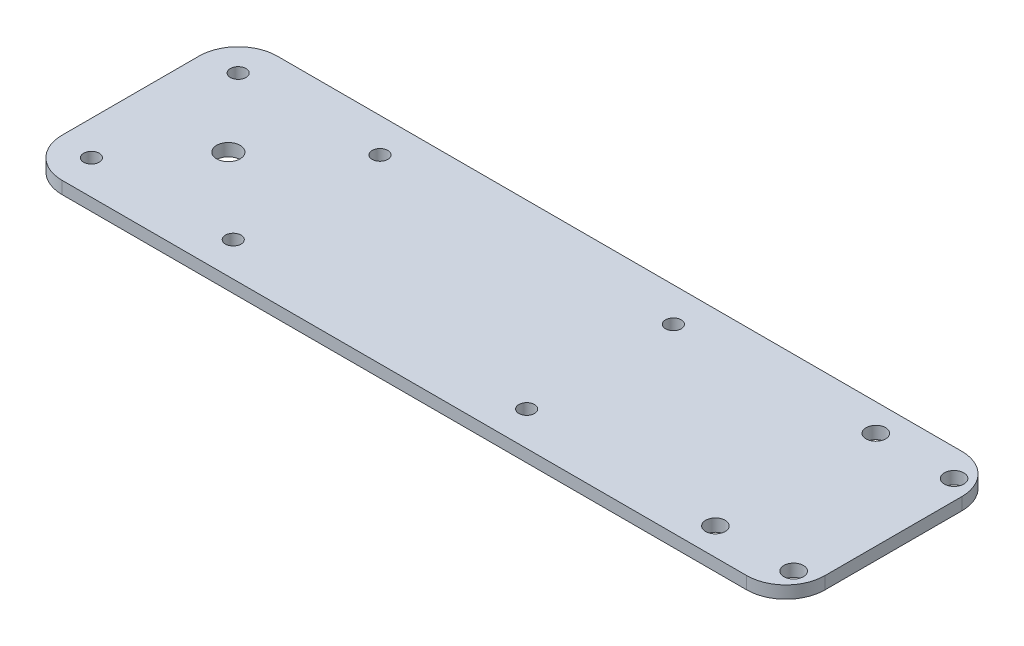
ISO-10303-21;
HEADER;
FILE_DESCRIPTION(('STEP AP214'),'2;1');
FILE_NAME('part.step','',(''),(''),'','','');
FILE_SCHEMA(('AUTOMOTIVE_DESIGN { 1 0 10303 214 1 1 1 1 }'));
ENDSEC;
DATA;
#1=APPLICATION_CONTEXT('core data for automotive mechanical design processes');
#2=APPLICATION_PROTOCOL_DEFINITION('international standard','automotive_design',2000,#1);
#3=PRODUCT_CONTEXT('',#1,'mechanical');
#4=PRODUCT('Part','Part','',(#3));
#5=PRODUCT_RELATED_PRODUCT_CATEGORY('part','',(#4));
#6=PRODUCT_DEFINITION_FORMATION('','',#4);
#7=PRODUCT_DEFINITION_CONTEXT('part definition',#1,'design');
#8=PRODUCT_DEFINITION('design','',#6,#7);
#9=PRODUCT_DEFINITION_SHAPE('','',#8);
#10=(LENGTH_UNIT() NAMED_UNIT(*) SI_UNIT(.MILLI.,.METRE.));
#11=(NAMED_UNIT(*) PLANE_ANGLE_UNIT() SI_UNIT($,.RADIAN.));
#12=(NAMED_UNIT(*) SI_UNIT($,.STERADIAN.) SOLID_ANGLE_UNIT());
#13=UNCERTAINTY_MEASURE_WITH_UNIT(LENGTH_MEASURE(1.E-05),#10,'distance_accuracy_value','');
#14=(GEOMETRIC_REPRESENTATION_CONTEXT(3) GLOBAL_UNCERTAINTY_ASSIGNED_CONTEXT((#13)) GLOBAL_UNIT_ASSIGNED_CONTEXT((#10,
#11,#12)) REPRESENTATION_CONTEXT('',''));
#15=CARTESIAN_POINT('',(0.,0.,0.));
#16=DIRECTION('',(0.,0.,1.));
#17=DIRECTION('',(1.,0.,0.));
#18=AXIS2_PLACEMENT_3D('',#15,#16,#17);
#19=CARTESIAN_POINT('',(-25.,3.175,-27.5));
#20=DIRECTION('',(1.,0.,0.));
#21=DIRECTION('',(0.,0.,-1.));
#22=AXIS2_PLACEMENT_3D('',#19,#20,#21);
#23=PLANE('',#22);
#24=DIRECTION('',(0.,0.,1.));
#25=VECTOR('',#24,1.);
#26=CARTESIAN_POINT('',(-25.,0.,-27.5));
#27=LINE('',#26,#25);
#28=CARTESIAN_POINT('',(-25.,0.,-17.5));
#29=VERTEX_POINT('',#28);
#30=CARTESIAN_POINT('',(-25.,0.,17.5));
#31=VERTEX_POINT('',#30);
#32=EDGE_CURVE('E136',#29,#31,#27,.T.);
#33=ORIENTED_EDGE('',*,*,#32,.T.);
#34=DIRECTION('',(0.,-1.,0.));
#35=VECTOR('',#34,1.);
#36=CARTESIAN_POINT('',(-25.,3.175,17.5));
#37=LINE('',#36,#35);
#38=CARTESIAN_POINT('',(-25.,3.175,17.5));
#39=VERTEX_POINT('',#38);
#40=EDGE_CURVE('E111',#31,#39,#37,.F.);
#41=ORIENTED_EDGE('',*,*,#40,.T.);
#42=DIRECTION('',(0.,0.,1.));
#43=VECTOR('',#42,1.);
#44=CARTESIAN_POINT('',(-25.,3.175,-27.5));
#45=LINE('',#44,#43);
#46=CARTESIAN_POINT('',(-25.,3.175,-17.5));
#47=VERTEX_POINT('',#46);
#48=EDGE_CURVE('E149',#47,#39,#45,.T.);
#49=ORIENTED_EDGE('',*,*,#48,.F.);
#50=DIRECTION('',(0.,-1.,0.));
#51=VECTOR('',#50,1.);
#52=CARTESIAN_POINT('',(-25.,3.175,-17.5));
#53=LINE('',#52,#51);
#54=EDGE_CURVE('E117',#47,#29,#53,.T.);
#55=ORIENTED_EDGE('',*,*,#54,.T.);
#56=EDGE_LOOP('',(#33,#41,#49,#55));
#57=FACE_BOUND('',#56,.T.);
#58=ADVANCED_FACE('F39',(#57),#23,.F.);
#59=CARTESIAN_POINT('',(-25.,3.175,27.5));
#60=DIRECTION('',(0.,0.,-1.));
#61=DIRECTION('',(-1.,0.,0.));
#62=AXIS2_PLACEMENT_3D('',#59,#60,#61);
#63=PLANE('',#62);
#64=DIRECTION('',(1.,0.,0.));
#65=VECTOR('',#64,1.);
#66=CARTESIAN_POINT('',(-25.,3.175,27.5));
#67=LINE('',#66,#65);
#68=CARTESIAN_POINT('',(-15.,3.175,27.5));
#69=VERTEX_POINT('',#68);
#70=CARTESIAN_POINT('',(160.,3.175,27.5));
#71=VERTEX_POINT('',#70);
#72=EDGE_CURVE('E127',#69,#71,#67,.T.);
#73=ORIENTED_EDGE('',*,*,#72,.F.);
#74=DIRECTION('',(0.,-1.,0.));
#75=VECTOR('',#74,1.);
#76=CARTESIAN_POINT('',(-15.,3.175,27.5));
#77=LINE('',#76,#75);
#78=CARTESIAN_POINT('',(-15.,0.,27.5));
#79=VERTEX_POINT('',#78);
#80=EDGE_CURVE('E110',#69,#79,#77,.T.);
#81=ORIENTED_EDGE('',*,*,#80,.T.);
#82=DIRECTION('',(1.,0.,0.));
#83=VECTOR('',#82,1.);
#84=CARTESIAN_POINT('',(-25.,0.,27.5));
#85=LINE('',#84,#83);
#86=CARTESIAN_POINT('',(160.,0.,27.5));
#87=VERTEX_POINT('',#86);
#88=EDGE_CURVE('E124',#79,#87,#85,.T.);
#89=ORIENTED_EDGE('',*,*,#88,.T.);
#90=DIRECTION('',(0.,-1.,0.));
#91=VECTOR('',#90,1.);
#92=CARTESIAN_POINT('',(160.,3.175,27.5));
#93=LINE('',#92,#91);
#94=EDGE_CURVE('E130',#87,#71,#93,.F.);
#95=ORIENTED_EDGE('',*,*,#94,.T.);
#96=EDGE_LOOP('',(#73,#81,#89,#95));
#97=FACE_BOUND('',#96,.T.);
#98=ADVANCED_FACE('F123',(#97),#63,.F.);
#99=CARTESIAN_POINT('',(170.,3.175,-27.5));
#100=DIRECTION('',(-1.,0.,0.));
#101=DIRECTION('',(0.,0.,1.));
#102=AXIS2_PLACEMENT_3D('',#99,#100,#101);
#103=PLANE('',#102);
#104=DIRECTION('',(0.,0.,-1.));
#105=VECTOR('',#104,1.);
#106=CARTESIAN_POINT('',(170.,0.,-27.5));
#107=LINE('',#106,#105);
#108=CARTESIAN_POINT('',(170.,0.,17.5));
#109=VERTEX_POINT('',#108);
#110=CARTESIAN_POINT('',(170.,0.,-17.5));
#111=VERTEX_POINT('',#110);
#112=EDGE_CURVE('E135',#109,#111,#107,.T.);
#113=ORIENTED_EDGE('',*,*,#112,.T.);
#114=DIRECTION('',(0.,-1.,0.));
#115=VECTOR('',#114,1.);
#116=CARTESIAN_POINT('',(170.,3.175,-17.5));
#117=LINE('',#116,#115);
#118=CARTESIAN_POINT('',(170.,3.175,-17.5));
#119=VERTEX_POINT('',#118);
#120=EDGE_CURVE('E11',#111,#119,#117,.F.);
#121=ORIENTED_EDGE('',*,*,#120,.T.);
#122=DIRECTION('',(0.,0.,-1.));
#123=VECTOR('',#122,1.);
#124=CARTESIAN_POINT('',(170.,3.175,-27.5));
#125=LINE('',#124,#123);
#126=CARTESIAN_POINT('',(170.,3.175,17.5));
#127=VERTEX_POINT('',#126);
#128=EDGE_CURVE('E188',#127,#119,#125,.T.);
#129=ORIENTED_EDGE('',*,*,#128,.F.);
#130=DIRECTION('',(0.,-1.,0.));
#131=VECTOR('',#130,1.);
#132=CARTESIAN_POINT('',(170.,3.175,17.5));
#133=LINE('',#132,#131);
#134=EDGE_CURVE('E48',#127,#109,#133,.T.);
#135=ORIENTED_EDGE('',*,*,#134,.T.);
#136=EDGE_LOOP('',(#113,#121,#129,#135));
#137=FACE_BOUND('',#136,.T.);
#138=ADVANCED_FACE('F186',(#137),#103,.F.);
#139=CARTESIAN_POINT('',(-25.,3.175,-27.5));
#140=DIRECTION('',(0.,0.,1.));
#141=DIRECTION('',(1.,0.,0.));
#142=AXIS2_PLACEMENT_3D('',#139,#140,#141);
#143=PLANE('',#142);
#144=DIRECTION('',(-1.,0.,0.));
#145=VECTOR('',#144,1.);
#146=CARTESIAN_POINT('',(-25.,0.,-27.5));
#147=LINE('',#146,#145);
#148=CARTESIAN_POINT('',(160.,0.,-27.5));
#149=VERTEX_POINT('',#148);
#150=CARTESIAN_POINT('',(-15.,0.,-27.5));
#151=VERTEX_POINT('',#150);
#152=EDGE_CURVE('E141',#149,#151,#147,.T.);
#153=ORIENTED_EDGE('',*,*,#152,.T.);
#154=DIRECTION('',(0.,-1.,0.));
#155=VECTOR('',#154,1.);
#156=CARTESIAN_POINT('',(-15.,3.175,-27.5));
#157=LINE('',#156,#155);
#158=CARTESIAN_POINT('',(-15.,3.175,-27.5));
#159=VERTEX_POINT('',#158);
#160=EDGE_CURVE('E55',#151,#159,#157,.F.);
#161=ORIENTED_EDGE('',*,*,#160,.T.);
#162=DIRECTION('',(-1.,0.,0.));
#163=VECTOR('',#162,1.);
#164=CARTESIAN_POINT('',(-25.,3.175,-27.5));
#165=LINE('',#164,#163);
#166=CARTESIAN_POINT('',(160.,3.175,-27.5));
#167=VERTEX_POINT('',#166);
#168=EDGE_CURVE('E151',#167,#159,#165,.T.);
#169=ORIENTED_EDGE('',*,*,#168,.F.);
#170=DIRECTION('',(0.,-1.,0.));
#171=VECTOR('',#170,1.);
#172=CARTESIAN_POINT('',(160.,3.175,-27.5));
#173=LINE('',#172,#171);
#174=EDGE_CURVE('E176',#167,#149,#173,.T.);
#175=ORIENTED_EDGE('',*,*,#174,.T.);
#176=EDGE_LOOP('',(#153,#161,#169,#175));
#177=FACE_BOUND('',#176,.T.);
#178=ADVANCED_FACE('F195',(#177),#143,.F.);
#179=CARTESIAN_POINT('',(0.,3.175,0.));
#180=DIRECTION('',(0.,1.,0.));
#181=DIRECTION('',(0.,0.,1.));
#182=AXIS2_PLACEMENT_3D('',#179,#180,#181);
#183=PLANE('',#182);
#184=CARTESIAN_POINT('',(165.,3.175,-20.5));
#185=DIRECTION('',(0.,1.,0.));
#186=DIRECTION('',(0.,0.,1.));
#187=AXIS2_PLACEMENT_3D('',#184,#185,#186);
#188=CIRCLE('',#187,2.5);
#189=CARTESIAN_POINT('',(165.,3.175,-18.));
#190=VERTEX_POINT('',#189);
#191=EDGE_CURVE('E289',#190,#190,#188,.T.);
#192=ORIENTED_EDGE('',*,*,#191,.F.);
#193=EDGE_LOOP('',(#192));
#194=FACE_BOUND('',#193,.T.);
#195=CARTESIAN_POINT('',(145.,3.175,-20.5));
#196=DIRECTION('',(0.,1.,0.));
#197=DIRECTION('',(0.,0.,1.));
#198=AXIS2_PLACEMENT_3D('',#195,#196,#197);
#199=CIRCLE('',#198,2.5);
#200=CARTESIAN_POINT('',(145.,3.175,-18.));
#201=VERTEX_POINT('',#200);
#202=EDGE_CURVE('E281',#201,#201,#199,.T.);
#203=ORIENTED_EDGE('',*,*,#202,.F.);
#204=EDGE_LOOP('',(#203));
#205=FACE_BOUND('',#204,.T.);
#206=CARTESIAN_POINT('',(165.,3.175,20.5));
#207=DIRECTION('',(0.,1.,0.));
#208=DIRECTION('',(0.,0.,1.));
#209=AXIS2_PLACEMENT_3D('',#206,#207,#208);
#210=CIRCLE('',#209,2.5);
#211=CARTESIAN_POINT('',(165.,3.175,23.));
#212=VERTEX_POINT('',#211);
#213=EDGE_CURVE('E273',#212,#212,#210,.T.);
#214=ORIENTED_EDGE('',*,*,#213,.F.);
#215=EDGE_LOOP('',(#214));
#216=FACE_BOUND('',#215,.T.);
#217=CARTESIAN_POINT('',(145.,3.175,20.5));
#218=DIRECTION('',(0.,1.,0.));
#219=DIRECTION('',(0.,0.,1.));
#220=AXIS2_PLACEMENT_3D('',#217,#218,#219);
#221=CIRCLE('',#220,2.5);
#222=CARTESIAN_POINT('',(145.,3.175,23.));
#223=VERTEX_POINT('',#222);
#224=EDGE_CURVE('E265',#223,#223,#221,.T.);
#225=ORIENTED_EDGE('',*,*,#224,.F.);
#226=EDGE_LOOP('',(#225));
#227=FACE_BOUND('',#226,.T.);
#228=CARTESIAN_POINT('',(-16.25,3.175,18.75));
#229=DIRECTION('',(0.,1.,0.));
#230=DIRECTION('',(0.,0.,1.));
#231=AXIS2_PLACEMENT_3D('',#228,#229,#230);
#232=CIRCLE('',#231,2.);
#233=CARTESIAN_POINT('',(-16.25,3.175,20.75));
#234=VERTEX_POINT('',#233);
#235=EDGE_CURVE('E257',#234,#234,#232,.T.);
#236=ORIENTED_EDGE('',*,*,#235,.F.);
#237=EDGE_LOOP('',(#236));
#238=FACE_BOUND('',#237,.T.);
#239=CARTESIAN_POINT('',(20.,3.175,18.75));
#240=DIRECTION('',(0.,1.,0.));
#241=DIRECTION('',(0.,0.,1.));
#242=AXIS2_PLACEMENT_3D('',#239,#240,#241);
#243=CIRCLE('',#242,2.);
#244=CARTESIAN_POINT('',(20.,3.175,20.75));
#245=VERTEX_POINT('',#244);
#246=EDGE_CURVE('E249',#245,#245,#243,.T.);
#247=ORIENTED_EDGE('',*,*,#246,.F.);
#248=EDGE_LOOP('',(#247));
#249=FACE_BOUND('',#248,.T.);
#250=CARTESIAN_POINT('',(95.,3.175,18.75));
#251=DIRECTION('',(0.,1.,0.));
#252=DIRECTION('',(0.,0.,1.));
#253=AXIS2_PLACEMENT_3D('',#250,#251,#252);
#254=CIRCLE('',#253,2.);
#255=CARTESIAN_POINT('',(95.,3.175,20.75));
#256=VERTEX_POINT('',#255);
#257=EDGE_CURVE('E241',#256,#256,#254,.T.);
#258=ORIENTED_EDGE('',*,*,#257,.F.);
#259=EDGE_LOOP('',(#258));
#260=FACE_BOUND('',#259,.T.);
#261=CARTESIAN_POINT('',(95.,3.175,-18.75));
#262=DIRECTION('',(0.,1.,0.));
#263=DIRECTION('',(0.,0.,1.));
#264=AXIS2_PLACEMENT_3D('',#261,#262,#263);
#265=CIRCLE('',#264,2.);
#266=CARTESIAN_POINT('',(95.,3.175,-16.75));
#267=VERTEX_POINT('',#266);
#268=EDGE_CURVE('E233',#267,#267,#265,.T.);
#269=ORIENTED_EDGE('',*,*,#268,.F.);
#270=EDGE_LOOP('',(#269));
#271=FACE_BOUND('',#270,.T.);
#272=CARTESIAN_POINT('',(20.,3.175,-18.75));
#273=DIRECTION('',(0.,1.,0.));
#274=DIRECTION('',(0.,0.,1.));
#275=AXIS2_PLACEMENT_3D('',#272,#273,#274);
#276=CIRCLE('',#275,2.);
#277=CARTESIAN_POINT('',(20.,3.175,-16.75));
#278=VERTEX_POINT('',#277);
#279=EDGE_CURVE('E225',#278,#278,#276,.T.);
#280=ORIENTED_EDGE('',*,*,#279,.F.);
#281=EDGE_LOOP('',(#280));
#282=FACE_BOUND('',#281,.T.);
#283=CARTESIAN_POINT('',(-16.25,3.175,-18.75));
#284=DIRECTION('',(0.,1.,0.));
#285=DIRECTION('',(0.,0.,1.));
#286=AXIS2_PLACEMENT_3D('',#283,#284,#285);
#287=CIRCLE('',#286,2.);
#288=CARTESIAN_POINT('',(-16.25,3.175,-16.75));
#289=VERTEX_POINT('',#288);
#290=EDGE_CURVE('E217',#289,#289,#287,.T.);
#291=ORIENTED_EDGE('',*,*,#290,.F.);
#292=EDGE_LOOP('',(#291));
#293=FACE_BOUND('',#292,.T.);
#294=CARTESIAN_POINT('',(0.,3.175,0.));
#295=DIRECTION('',(0.,1.,0.));
#296=DIRECTION('',(0.,0.,1.));
#297=AXIS2_PLACEMENT_3D('',#294,#295,#296);
#298=CIRCLE('',#297,3.);
#299=CARTESIAN_POINT('',(0.,3.175,3.));
#300=VERTEX_POINT('',#299);
#301=EDGE_CURVE('E209',#300,#300,#298,.T.);
#302=ORIENTED_EDGE('',*,*,#301,.F.);
#303=EDGE_LOOP('',(#302));
#304=FACE_BOUND('',#303,.T.);
#305=ORIENTED_EDGE('',*,*,#48,.T.);
#306=CARTESIAN_POINT('',(-15.,3.175,17.5));
#307=DIRECTION('',(0.,1.,0.));
#308=DIRECTION('',(0.,0.,1.));
#309=AXIS2_PLACEMENT_3D('',#306,#307,#308);
#310=CIRCLE('',#309,10.);
#311=EDGE_CURVE('E173',#39,#69,#310,.T.);
#312=ORIENTED_EDGE('',*,*,#311,.T.);
#313=ORIENTED_EDGE('',*,*,#72,.T.);
#314=CARTESIAN_POINT('',(160.,3.175,17.5));
#315=DIRECTION('',(0.,1.,0.));
#316=DIRECTION('',(0.,0.,1.));
#317=AXIS2_PLACEMENT_3D('',#314,#315,#316);
#318=CIRCLE('',#317,10.);
#319=EDGE_CURVE('E165',#71,#127,#318,.T.);
#320=ORIENTED_EDGE('',*,*,#319,.T.);
#321=ORIENTED_EDGE('',*,*,#128,.T.);
#322=CARTESIAN_POINT('',(160.,3.175,-17.5));
#323=DIRECTION('',(0.,1.,0.));
#324=DIRECTION('',(0.,0.,1.));
#325=AXIS2_PLACEMENT_3D('',#322,#323,#324);
#326=CIRCLE('',#325,10.);
#327=EDGE_CURVE('E62',#119,#167,#326,.T.);
#328=ORIENTED_EDGE('',*,*,#327,.T.);
#329=ORIENTED_EDGE('',*,*,#168,.T.);
#330=CARTESIAN_POINT('',(-15.,3.175,-17.5));
#331=DIRECTION('',(0.,1.,0.));
#332=DIRECTION('',(0.,0.,1.));
#333=AXIS2_PLACEMENT_3D('',#330,#331,#332);
#334=CIRCLE('',#333,10.);
#335=EDGE_CURVE('E170',#159,#47,#334,.T.);
#336=ORIENTED_EDGE('',*,*,#335,.T.);
#337=EDGE_LOOP('',(#305,#312,#313,#320,#321,#328,#329,#336));
#338=FACE_BOUND('',#337,.T.);
#339=ADVANCED_FACE('F296',(#194,#205,#216,#227,#238,#249,#260,#271,#282,#293,#304,#338),#183,.T.);
#340=CARTESIAN_POINT('',(0.,0.,0.));
#341=DIRECTION('',(0.,1.,0.));
#342=DIRECTION('',(0.,0.,1.));
#343=AXIS2_PLACEMENT_3D('',#340,#341,#342);
#344=PLANE('',#343);
#345=CARTESIAN_POINT('',(165.,0.,-20.5));
#346=DIRECTION('',(0.,1.,0.));
#347=DIRECTION('',(0.,0.,1.));
#348=AXIS2_PLACEMENT_3D('',#345,#346,#347);
#349=CIRCLE('',#348,2.5);
#350=CARTESIAN_POINT('',(165.,0.,-18.));
#351=VERTEX_POINT('',#350);
#352=EDGE_CURVE('E285',#351,#351,#349,.T.);
#353=ORIENTED_EDGE('',*,*,#352,.T.);
#354=EDGE_LOOP('',(#353));
#355=FACE_BOUND('',#354,.T.);
#356=CARTESIAN_POINT('',(145.,0.,-20.5));
#357=DIRECTION('',(0.,1.,0.));
#358=DIRECTION('',(0.,0.,1.));
#359=AXIS2_PLACEMENT_3D('',#356,#357,#358);
#360=CIRCLE('',#359,2.5);
#361=CARTESIAN_POINT('',(145.,0.,-18.));
#362=VERTEX_POINT('',#361);
#363=EDGE_CURVE('E277',#362,#362,#360,.T.);
#364=ORIENTED_EDGE('',*,*,#363,.T.);
#365=EDGE_LOOP('',(#364));
#366=FACE_BOUND('',#365,.T.);
#367=CARTESIAN_POINT('',(165.,0.,20.5));
#368=DIRECTION('',(0.,1.,0.));
#369=DIRECTION('',(0.,0.,1.));
#370=AXIS2_PLACEMENT_3D('',#367,#368,#369);
#371=CIRCLE('',#370,2.5);
#372=CARTESIAN_POINT('',(165.,0.,23.));
#373=VERTEX_POINT('',#372);
#374=EDGE_CURVE('E269',#373,#373,#371,.T.);
#375=ORIENTED_EDGE('',*,*,#374,.T.);
#376=EDGE_LOOP('',(#375));
#377=FACE_BOUND('',#376,.T.);
#378=CARTESIAN_POINT('',(145.,0.,20.5));
#379=DIRECTION('',(0.,1.,0.));
#380=DIRECTION('',(0.,0.,1.));
#381=AXIS2_PLACEMENT_3D('',#378,#379,#380);
#382=CIRCLE('',#381,2.5);
#383=CARTESIAN_POINT('',(145.,0.,23.));
#384=VERTEX_POINT('',#383);
#385=EDGE_CURVE('E261',#384,#384,#382,.T.);
#386=ORIENTED_EDGE('',*,*,#385,.T.);
#387=EDGE_LOOP('',(#386));
#388=FACE_BOUND('',#387,.T.);
#389=CARTESIAN_POINT('',(-16.25,0.,18.75));
#390=DIRECTION('',(0.,1.,0.));
#391=DIRECTION('',(0.,0.,1.));
#392=AXIS2_PLACEMENT_3D('',#389,#390,#391);
#393=CIRCLE('',#392,2.);
#394=CARTESIAN_POINT('',(-16.25,0.,20.75));
#395=VERTEX_POINT('',#394);
#396=EDGE_CURVE('E253',#395,#395,#393,.T.);
#397=ORIENTED_EDGE('',*,*,#396,.T.);
#398=EDGE_LOOP('',(#397));
#399=FACE_BOUND('',#398,.T.);
#400=CARTESIAN_POINT('',(20.,0.,18.75));
#401=DIRECTION('',(0.,1.,0.));
#402=DIRECTION('',(0.,0.,1.));
#403=AXIS2_PLACEMENT_3D('',#400,#401,#402);
#404=CIRCLE('',#403,2.);
#405=CARTESIAN_POINT('',(20.,0.,20.75));
#406=VERTEX_POINT('',#405);
#407=EDGE_CURVE('E245',#406,#406,#404,.T.);
#408=ORIENTED_EDGE('',*,*,#407,.T.);
#409=EDGE_LOOP('',(#408));
#410=FACE_BOUND('',#409,.T.);
#411=CARTESIAN_POINT('',(95.,0.,18.75));
#412=DIRECTION('',(0.,1.,0.));
#413=DIRECTION('',(0.,0.,1.));
#414=AXIS2_PLACEMENT_3D('',#411,#412,#413);
#415=CIRCLE('',#414,2.);
#416=CARTESIAN_POINT('',(95.,0.,20.75));
#417=VERTEX_POINT('',#416);
#418=EDGE_CURVE('E237',#417,#417,#415,.T.);
#419=ORIENTED_EDGE('',*,*,#418,.T.);
#420=EDGE_LOOP('',(#419));
#421=FACE_BOUND('',#420,.T.);
#422=CARTESIAN_POINT('',(95.,0.,-18.75));
#423=DIRECTION('',(0.,1.,0.));
#424=DIRECTION('',(0.,0.,1.));
#425=AXIS2_PLACEMENT_3D('',#422,#423,#424);
#426=CIRCLE('',#425,2.);
#427=CARTESIAN_POINT('',(95.,0.,-16.75));
#428=VERTEX_POINT('',#427);
#429=EDGE_CURVE('E229',#428,#428,#426,.T.);
#430=ORIENTED_EDGE('',*,*,#429,.T.);
#431=EDGE_LOOP('',(#430));
#432=FACE_BOUND('',#431,.T.);
#433=CARTESIAN_POINT('',(20.,0.,-18.75));
#434=DIRECTION('',(0.,1.,0.));
#435=DIRECTION('',(0.,0.,1.));
#436=AXIS2_PLACEMENT_3D('',#433,#434,#435);
#437=CIRCLE('',#436,2.);
#438=CARTESIAN_POINT('',(20.,0.,-16.75));
#439=VERTEX_POINT('',#438);
#440=EDGE_CURVE('E221',#439,#439,#437,.T.);
#441=ORIENTED_EDGE('',*,*,#440,.T.);
#442=EDGE_LOOP('',(#441));
#443=FACE_BOUND('',#442,.T.);
#444=CARTESIAN_POINT('',(-16.25,0.,-18.75));
#445=DIRECTION('',(0.,1.,0.));
#446=DIRECTION('',(0.,0.,1.));
#447=AXIS2_PLACEMENT_3D('',#444,#445,#446);
#448=CIRCLE('',#447,2.);
#449=CARTESIAN_POINT('',(-16.25,0.,-16.75));
#450=VERTEX_POINT('',#449);
#451=EDGE_CURVE('E213',#450,#450,#448,.T.);
#452=ORIENTED_EDGE('',*,*,#451,.T.);
#453=EDGE_LOOP('',(#452));
#454=FACE_BOUND('',#453,.T.);
#455=CARTESIAN_POINT('',(0.,0.,0.));
#456=DIRECTION('',(0.,1.,0.));
#457=DIRECTION('',(0.,0.,1.));
#458=AXIS2_PLACEMENT_3D('',#455,#456,#457);
#459=CIRCLE('',#458,3.);
#460=CARTESIAN_POINT('',(0.,0.,3.));
#461=VERTEX_POINT('',#460);
#462=EDGE_CURVE('E143',#461,#461,#459,.T.);
#463=ORIENTED_EDGE('',*,*,#462,.T.);
#464=EDGE_LOOP('',(#463));
#465=FACE_BOUND('',#464,.T.);
#466=ORIENTED_EDGE('',*,*,#88,.F.);
#467=CARTESIAN_POINT('',(-15.,0.,17.5));
#468=DIRECTION('',(0.,1.,0.));
#469=DIRECTION('',(0.,0.,1.));
#470=AXIS2_PLACEMENT_3D('',#467,#468,#469);
#471=CIRCLE('',#470,10.);
#472=EDGE_CURVE('E106',#79,#31,#471,.F.);
#473=ORIENTED_EDGE('',*,*,#472,.T.);
#474=ORIENTED_EDGE('',*,*,#32,.F.);
#475=CARTESIAN_POINT('',(-15.,0.,-17.5));
#476=DIRECTION('',(0.,1.,0.));
#477=DIRECTION('',(0.,0.,1.));
#478=AXIS2_PLACEMENT_3D('',#475,#476,#477);
#479=CIRCLE('',#478,10.);
#480=EDGE_CURVE('E118',#29,#151,#479,.F.);
#481=ORIENTED_EDGE('',*,*,#480,.T.);
#482=ORIENTED_EDGE('',*,*,#152,.F.);
#483=CARTESIAN_POINT('',(160.,0.,-17.5));
#484=DIRECTION('',(0.,1.,0.));
#485=DIRECTION('',(0.,0.,1.));
#486=AXIS2_PLACEMENT_3D('',#483,#484,#485);
#487=CIRCLE('',#486,10.);
#488=EDGE_CURVE('E155',#149,#111,#487,.F.);
#489=ORIENTED_EDGE('',*,*,#488,.T.);
#490=ORIENTED_EDGE('',*,*,#112,.F.);
#491=CARTESIAN_POINT('',(160.,0.,17.5));
#492=DIRECTION('',(0.,1.,0.));
#493=DIRECTION('',(0.,0.,1.));
#494=AXIS2_PLACEMENT_3D('',#491,#492,#493);
#495=CIRCLE('',#494,10.);
#496=EDGE_CURVE('E129',#109,#87,#495,.F.);
#497=ORIENTED_EDGE('',*,*,#496,.T.);
#498=EDGE_LOOP('',(#466,#473,#474,#481,#482,#489,#490,#497));
#499=FACE_BOUND('',#498,.T.);
#500=ADVANCED_FACE('F132',(#355,#366,#377,#388,#399,#410,#421,#432,#443,#454,#465,#499),#344,.F.);
#501=CARTESIAN_POINT('',(-15.,3.175,17.5));
#502=DIRECTION('',(0.,-1.,0.));
#503=DIRECTION('',(0.,0.,-1.));
#504=AXIS2_PLACEMENT_3D('',#501,#502,#503);
#505=CYLINDRICAL_SURFACE('',#504,10.);
#506=ORIENTED_EDGE('',*,*,#311,.F.);
#507=ORIENTED_EDGE('',*,*,#40,.F.);
#508=ORIENTED_EDGE('',*,*,#472,.F.);
#509=ORIENTED_EDGE('',*,*,#80,.F.);
#510=EDGE_LOOP('',(#506,#507,#508,#509));
#511=FACE_BOUND('',#510,.T.);
#512=ADVANCED_FACE('F109',(#511),#505,.T.);
#513=CARTESIAN_POINT('',(-15.,3.175,-17.5));
#514=DIRECTION('',(0.,-1.,0.));
#515=DIRECTION('',(0.,0.,-1.));
#516=AXIS2_PLACEMENT_3D('',#513,#514,#515);
#517=CYLINDRICAL_SURFACE('',#516,10.);
#518=ORIENTED_EDGE('',*,*,#335,.F.);
#519=ORIENTED_EDGE('',*,*,#160,.F.);
#520=ORIENTED_EDGE('',*,*,#480,.F.);
#521=ORIENTED_EDGE('',*,*,#54,.F.);
#522=EDGE_LOOP('',(#518,#519,#520,#521));
#523=FACE_BOUND('',#522,.T.);
#524=ADVANCED_FACE('F323',(#523),#517,.T.);
#525=CARTESIAN_POINT('',(160.,3.175,-17.5));
#526=DIRECTION('',(0.,-1.,0.));
#527=DIRECTION('',(0.,0.,-1.));
#528=AXIS2_PLACEMENT_3D('',#525,#526,#527);
#529=CYLINDRICAL_SURFACE('',#528,10.);
#530=ORIENTED_EDGE('',*,*,#327,.F.);
#531=ORIENTED_EDGE('',*,*,#120,.F.);
#532=ORIENTED_EDGE('',*,*,#488,.F.);
#533=ORIENTED_EDGE('',*,*,#174,.F.);
#534=EDGE_LOOP('',(#530,#531,#532,#533));
#535=FACE_BOUND('',#534,.T.);
#536=ADVANCED_FACE('F194',(#535),#529,.T.);
#537=CARTESIAN_POINT('',(160.,3.175,17.5));
#538=DIRECTION('',(0.,-1.,0.));
#539=DIRECTION('',(0.,0.,-1.));
#540=AXIS2_PLACEMENT_3D('',#537,#538,#539);
#541=CYLINDRICAL_SURFACE('',#540,10.);
#542=ORIENTED_EDGE('',*,*,#319,.F.);
#543=ORIENTED_EDGE('',*,*,#94,.F.);
#544=ORIENTED_EDGE('',*,*,#496,.F.);
#545=ORIENTED_EDGE('',*,*,#134,.F.);
#546=EDGE_LOOP('',(#542,#543,#544,#545));
#547=FACE_BOUND('',#546,.T.);
#548=ADVANCED_FACE('F41',(#547),#541,.T.);
#549=CARTESIAN_POINT('',(0.,3.175,0.));
#550=DIRECTION('',(0.,1.,0.));
#551=DIRECTION('',(0.,0.,1.));
#552=AXIS2_PLACEMENT_3D('',#549,#550,#551);
#553=CYLINDRICAL_SURFACE('',#552,3.);
#554=ORIENTED_EDGE('',*,*,#462,.F.);
#555=EDGE_LOOP('',(#554));
#556=FACE_BOUND('',#555,.T.);
#557=ORIENTED_EDGE('',*,*,#301,.T.);
#558=EDGE_LOOP('',(#557));
#559=FACE_BOUND('',#558,.T.);
#560=ADVANCED_FACE('F345',(#556,#559),#553,.F.);
#561=CARTESIAN_POINT('',(-16.25,3.175,-18.75));
#562=DIRECTION('',(0.,1.,0.));
#563=DIRECTION('',(0.,0.,1.));
#564=AXIS2_PLACEMENT_3D('',#561,#562,#563);
#565=CYLINDRICAL_SURFACE('',#564,2.);
#566=ORIENTED_EDGE('',*,*,#451,.F.);
#567=EDGE_LOOP('',(#566));
#568=FACE_BOUND('',#567,.T.);
#569=ORIENTED_EDGE('',*,*,#290,.T.);
#570=EDGE_LOOP('',(#569));
#571=FACE_BOUND('',#570,.T.);
#572=ADVANCED_FACE('F348',(#568,#571),#565,.F.);
#573=CARTESIAN_POINT('',(20.,3.175,-18.75));
#574=DIRECTION('',(0.,1.,0.));
#575=DIRECTION('',(0.,0.,1.));
#576=AXIS2_PLACEMENT_3D('',#573,#574,#575);
#577=CYLINDRICAL_SURFACE('',#576,2.);
#578=ORIENTED_EDGE('',*,*,#440,.F.);
#579=EDGE_LOOP('',(#578));
#580=FACE_BOUND('',#579,.T.);
#581=ORIENTED_EDGE('',*,*,#279,.T.);
#582=EDGE_LOOP('',(#581));
#583=FACE_BOUND('',#582,.T.);
#584=ADVANCED_FACE('F352',(#580,#583),#577,.F.);
#585=CARTESIAN_POINT('',(95.,3.175,-18.75));
#586=DIRECTION('',(0.,1.,0.));
#587=DIRECTION('',(0.,0.,1.));
#588=AXIS2_PLACEMENT_3D('',#585,#586,#587);
#589=CYLINDRICAL_SURFACE('',#588,2.);
#590=ORIENTED_EDGE('',*,*,#429,.F.);
#591=EDGE_LOOP('',(#590));
#592=FACE_BOUND('',#591,.T.);
#593=ORIENTED_EDGE('',*,*,#268,.T.);
#594=EDGE_LOOP('',(#593));
#595=FACE_BOUND('',#594,.T.);
#596=ADVANCED_FACE('F356',(#592,#595),#589,.F.);
#597=CARTESIAN_POINT('',(95.,3.175,18.75));
#598=DIRECTION('',(0.,1.,0.));
#599=DIRECTION('',(0.,0.,1.));
#600=AXIS2_PLACEMENT_3D('',#597,#598,#599);
#601=CYLINDRICAL_SURFACE('',#600,2.);
#602=ORIENTED_EDGE('',*,*,#418,.F.);
#603=EDGE_LOOP('',(#602));
#604=FACE_BOUND('',#603,.T.);
#605=ORIENTED_EDGE('',*,*,#257,.T.);
#606=EDGE_LOOP('',(#605));
#607=FACE_BOUND('',#606,.T.);
#608=ADVANCED_FACE('F360',(#604,#607),#601,.F.);
#609=CARTESIAN_POINT('',(20.,3.175,18.75));
#610=DIRECTION('',(0.,1.,0.));
#611=DIRECTION('',(0.,0.,1.));
#612=AXIS2_PLACEMENT_3D('',#609,#610,#611);
#613=CYLINDRICAL_SURFACE('',#612,2.);
#614=ORIENTED_EDGE('',*,*,#407,.F.);
#615=EDGE_LOOP('',(#614));
#616=FACE_BOUND('',#615,.T.);
#617=ORIENTED_EDGE('',*,*,#246,.T.);
#618=EDGE_LOOP('',(#617));
#619=FACE_BOUND('',#618,.T.);
#620=ADVANCED_FACE('F364',(#616,#619),#613,.F.);
#621=CARTESIAN_POINT('',(-16.25,3.175,18.75));
#622=DIRECTION('',(0.,1.,0.));
#623=DIRECTION('',(0.,0.,1.));
#624=AXIS2_PLACEMENT_3D('',#621,#622,#623);
#625=CYLINDRICAL_SURFACE('',#624,2.);
#626=ORIENTED_EDGE('',*,*,#396,.F.);
#627=EDGE_LOOP('',(#626));
#628=FACE_BOUND('',#627,.T.);
#629=ORIENTED_EDGE('',*,*,#235,.T.);
#630=EDGE_LOOP('',(#629));
#631=FACE_BOUND('',#630,.T.);
#632=ADVANCED_FACE('F368',(#628,#631),#625,.F.);
#633=CARTESIAN_POINT('',(145.,3.175,20.5));
#634=DIRECTION('',(0.,1.,0.));
#635=DIRECTION('',(0.,0.,1.));
#636=AXIS2_PLACEMENT_3D('',#633,#634,#635);
#637=CYLINDRICAL_SURFACE('',#636,2.5);
#638=ORIENTED_EDGE('',*,*,#385,.F.);
#639=EDGE_LOOP('',(#638));
#640=FACE_BOUND('',#639,.T.);
#641=ORIENTED_EDGE('',*,*,#224,.T.);
#642=EDGE_LOOP('',(#641));
#643=FACE_BOUND('',#642,.T.);
#644=ADVANCED_FACE('F372',(#640,#643),#637,.F.);
#645=CARTESIAN_POINT('',(165.,3.175,20.5));
#646=DIRECTION('',(0.,1.,0.));
#647=DIRECTION('',(0.,0.,1.));
#648=AXIS2_PLACEMENT_3D('',#645,#646,#647);
#649=CYLINDRICAL_SURFACE('',#648,2.5);
#650=ORIENTED_EDGE('',*,*,#374,.F.);
#651=EDGE_LOOP('',(#650));
#652=FACE_BOUND('',#651,.T.);
#653=ORIENTED_EDGE('',*,*,#213,.T.);
#654=EDGE_LOOP('',(#653));
#655=FACE_BOUND('',#654,.T.);
#656=ADVANCED_FACE('F376',(#652,#655),#649,.F.);
#657=CARTESIAN_POINT('',(145.,3.175,-20.5));
#658=DIRECTION('',(0.,1.,0.));
#659=DIRECTION('',(0.,0.,1.));
#660=AXIS2_PLACEMENT_3D('',#657,#658,#659);
#661=CYLINDRICAL_SURFACE('',#660,2.5);
#662=ORIENTED_EDGE('',*,*,#363,.F.);
#663=EDGE_LOOP('',(#662));
#664=FACE_BOUND('',#663,.T.);
#665=ORIENTED_EDGE('',*,*,#202,.T.);
#666=EDGE_LOOP('',(#665));
#667=FACE_BOUND('',#666,.T.);
#668=ADVANCED_FACE('F380',(#664,#667),#661,.F.);
#669=CARTESIAN_POINT('',(165.,3.175,-20.5));
#670=DIRECTION('',(0.,1.,0.));
#671=DIRECTION('',(0.,0.,1.));
#672=AXIS2_PLACEMENT_3D('',#669,#670,#671);
#673=CYLINDRICAL_SURFACE('',#672,2.5);
#674=ORIENTED_EDGE('',*,*,#352,.F.);
#675=EDGE_LOOP('',(#674));
#676=FACE_BOUND('',#675,.T.);
#677=ORIENTED_EDGE('',*,*,#191,.T.);
#678=EDGE_LOOP('',(#677));
#679=FACE_BOUND('',#678,.T.);
#680=ADVANCED_FACE('F294',(#676,#679),#673,.F.);
#681=CLOSED_SHELL('',(#58,#98,#138,#178,#339,#500,#512,#524,#536,#548,#560,#572,#584,#596,#608,
#620,#632,#644,#656,#668,#680));
#682=MANIFOLD_SOLID_BREP('B2',#681);
#683=ADVANCED_BREP_SHAPE_REPRESENTATION('',(#18,#682),#14);
#684=SHAPE_DEFINITION_REPRESENTATION(#9,#683);
ENDSEC;
END-ISO-10303-21;
